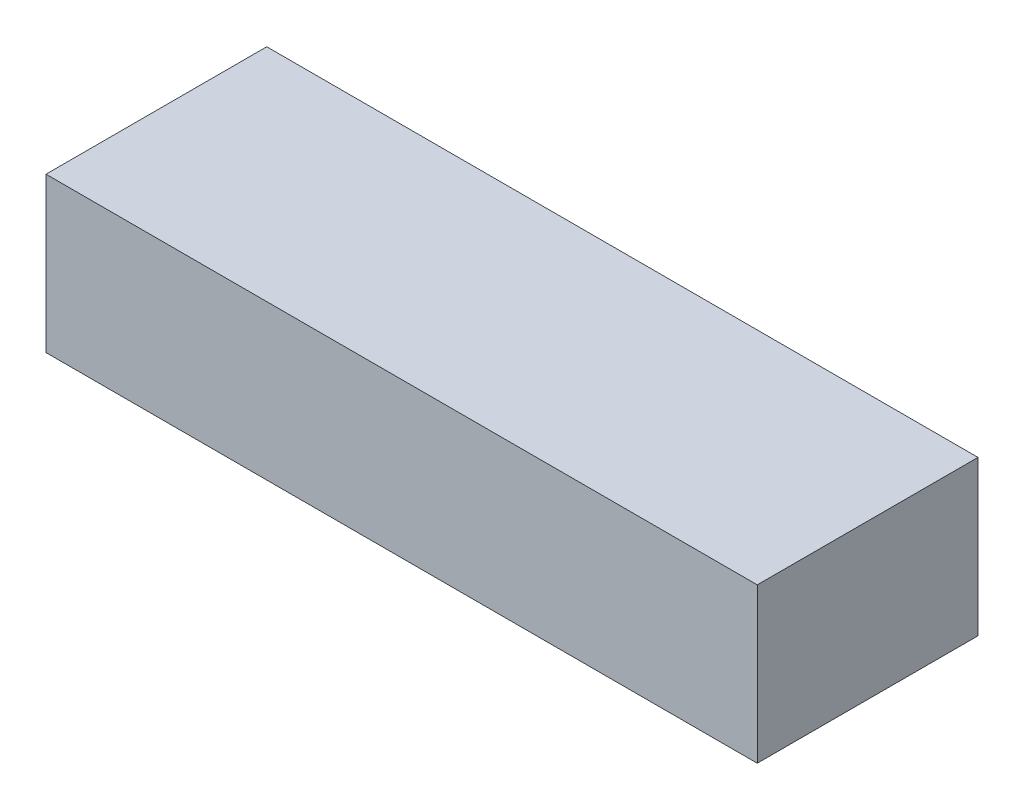
ISO-10303-21;
HEADER;
FILE_DESCRIPTION(('STEP AP214'),'2;1');
FILE_NAME('part.step','',(''),(''),'','','');
FILE_SCHEMA(('AUTOMOTIVE_DESIGN { 1 0 10303 214 1 1 1 1 }'));
ENDSEC;
DATA;
#1=APPLICATION_CONTEXT('core data for automotive mechanical design processes');
#2=APPLICATION_PROTOCOL_DEFINITION('international standard','automotive_design',2000,#1);
#3=PRODUCT_CONTEXT('',#1,'mechanical');
#4=PRODUCT('Part','Part','',(#3));
#5=PRODUCT_RELATED_PRODUCT_CATEGORY('part','',(#4));
#6=PRODUCT_DEFINITION_FORMATION('','',#4);
#7=PRODUCT_DEFINITION_CONTEXT('part definition',#1,'design');
#8=PRODUCT_DEFINITION('design','',#6,#7);
#9=PRODUCT_DEFINITION_SHAPE('','',#8);
#10=(LENGTH_UNIT() NAMED_UNIT(*) SI_UNIT(.MILLI.,.METRE.));
#11=(NAMED_UNIT(*) PLANE_ANGLE_UNIT() SI_UNIT($,.RADIAN.));
#12=(NAMED_UNIT(*) SI_UNIT($,.STERADIAN.) SOLID_ANGLE_UNIT());
#13=UNCERTAINTY_MEASURE_WITH_UNIT(LENGTH_MEASURE(1.E-05),#10,'distance_accuracy_value','');
#14=(GEOMETRIC_REPRESENTATION_CONTEXT(3) GLOBAL_UNCERTAINTY_ASSIGNED_CONTEXT((#13)) GLOBAL_UNIT_ASSIGNED_CONTEXT((#10,
#11,#12)) REPRESENTATION_CONTEXT('',''));
#15=CARTESIAN_POINT('',(0.,0.,0.));
#16=DIRECTION('',(0.,0.,1.));
#17=DIRECTION('',(1.,0.,0.));
#18=AXIS2_PLACEMENT_3D('',#15,#16,#17);
#19=CARTESIAN_POINT('',(72.5,31.5,22.5));
#20=DIRECTION('',(-1.,0.,0.));
#21=DIRECTION('',(0.,0.,1.));
#22=AXIS2_PLACEMENT_3D('',#19,#20,#21);
#23=PLANE('',#22);
#24=DIRECTION('',(0.,0.,-1.));
#25=VECTOR('',#24,1.);
#26=CARTESIAN_POINT('',(72.5,0.,22.5));
#27=LINE('',#26,#25);
#28=CARTESIAN_POINT('',(72.5,0.,22.5));
#29=VERTEX_POINT('',#28);
#30=CARTESIAN_POINT('',(72.5,0.,-22.5));
#31=VERTEX_POINT('',#30);
#32=EDGE_CURVE('E113',#29,#31,#27,.T.);
#33=ORIENTED_EDGE('',*,*,#32,.T.);
#34=DIRECTION('',(0.,-1.,0.));
#35=VECTOR('',#34,1.);
#36=CARTESIAN_POINT('',(72.5,31.5,-22.5));
#37=LINE('',#36,#35);
#38=CARTESIAN_POINT('',(72.5,31.5,-22.5));
#39=VERTEX_POINT('',#38);
#40=EDGE_CURVE('E11',#39,#31,#37,.T.);
#41=ORIENTED_EDGE('',*,*,#40,.F.);
#42=DIRECTION('',(0.,0.,-1.));
#43=VECTOR('',#42,1.);
#44=CARTESIAN_POINT('',(72.5,31.5,22.5));
#45=LINE('',#44,#43);
#46=CARTESIAN_POINT('',(72.5,31.5,22.5));
#47=VERTEX_POINT('',#46);
#48=EDGE_CURVE('E97',#47,#39,#45,.T.);
#49=ORIENTED_EDGE('',*,*,#48,.F.);
#50=DIRECTION('',(0.,-1.,0.));
#51=VECTOR('',#50,1.);
#52=CARTESIAN_POINT('',(72.5,31.5,22.5));
#53=LINE('',#52,#51);
#54=EDGE_CURVE('E109',#47,#29,#53,.T.);
#55=ORIENTED_EDGE('',*,*,#54,.T.);
#56=EDGE_LOOP('',(#33,#41,#49,#55));
#57=FACE_BOUND('',#56,.T.);
#58=ADVANCED_FACE('F45',(#57),#23,.F.);
#59=CARTESIAN_POINT('',(-72.5,31.5,-22.5));
#60=DIRECTION('',(0.,0.,1.));
#61=DIRECTION('',(1.,0.,0.));
#62=AXIS2_PLACEMENT_3D('',#59,#60,#61);
#63=PLANE('',#62);
#64=DIRECTION('',(-1.,0.,0.));
#65=VECTOR('',#64,1.);
#66=CARTESIAN_POINT('',(-72.5,0.,-22.5));
#67=LINE('',#66,#65);
#68=CARTESIAN_POINT('',(-72.5,0.,-22.5));
#69=VERTEX_POINT('',#68);
#70=EDGE_CURVE('E102',#31,#69,#67,.T.);
#71=ORIENTED_EDGE('',*,*,#70,.T.);
#72=DIRECTION('',(0.,-1.,0.));
#73=VECTOR('',#72,1.);
#74=CARTESIAN_POINT('',(-72.5,31.5,-22.5));
#75=LINE('',#74,#73);
#76=CARTESIAN_POINT('',(-72.5,31.5,-22.5));
#77=VERTEX_POINT('',#76);
#78=EDGE_CURVE('E54',#77,#69,#75,.T.);
#79=ORIENTED_EDGE('',*,*,#78,.F.);
#80=DIRECTION('',(-1.,0.,0.));
#81=VECTOR('',#80,1.);
#82=CARTESIAN_POINT('',(-72.5,31.5,-22.5));
#83=LINE('',#82,#81);
#84=EDGE_CURVE('E92',#39,#77,#83,.T.);
#85=ORIENTED_EDGE('',*,*,#84,.F.);
#86=ORIENTED_EDGE('',*,*,#40,.T.);
#87=EDGE_LOOP('',(#71,#79,#85,#86));
#88=FACE_BOUND('',#87,.T.);
#89=ADVANCED_FACE('F101',(#88),#63,.F.);
#90=CARTESIAN_POINT('',(-72.5,31.5,22.5));
#91=DIRECTION('',(1.,0.,0.));
#92=DIRECTION('',(0.,0.,-1.));
#93=AXIS2_PLACEMENT_3D('',#90,#91,#92);
#94=PLANE('',#93);
#95=DIRECTION('',(0.,0.,1.));
#96=VECTOR('',#95,1.);
#97=CARTESIAN_POINT('',(-72.5,0.,22.5));
#98=LINE('',#97,#96);
#99=CARTESIAN_POINT('',(-72.5,0.,22.5));
#100=VERTEX_POINT('',#99);
#101=EDGE_CURVE('E79',#69,#100,#98,.T.);
#102=ORIENTED_EDGE('',*,*,#101,.T.);
#103=DIRECTION('',(0.,-1.,0.));
#104=VECTOR('',#103,1.);
#105=CARTESIAN_POINT('',(-72.5,31.5,22.5));
#106=LINE('',#105,#104);
#107=CARTESIAN_POINT('',(-72.5,31.5,22.5));
#108=VERTEX_POINT('',#107);
#109=EDGE_CURVE('E104',#108,#100,#106,.T.);
#110=ORIENTED_EDGE('',*,*,#109,.F.);
#111=DIRECTION('',(0.,0.,1.));
#112=VECTOR('',#111,1.);
#113=CARTESIAN_POINT('',(-72.5,31.5,22.5));
#114=LINE('',#113,#112);
#115=EDGE_CURVE('E95',#77,#108,#114,.T.);
#116=ORIENTED_EDGE('',*,*,#115,.F.);
#117=ORIENTED_EDGE('',*,*,#78,.T.);
#118=EDGE_LOOP('',(#102,#110,#116,#117));
#119=FACE_BOUND('',#118,.T.);
#120=ADVANCED_FACE('F105',(#119),#94,.F.);
#121=CARTESIAN_POINT('',(-72.5,31.5,22.5));
#122=DIRECTION('',(0.,0.,-1.));
#123=DIRECTION('',(-1.,0.,0.));
#124=AXIS2_PLACEMENT_3D('',#121,#122,#123);
#125=PLANE('',#124);
#126=DIRECTION('',(1.,0.,0.));
#127=VECTOR('',#126,1.);
#128=CARTESIAN_POINT('',(-72.5,0.,22.5));
#129=LINE('',#128,#127);
#130=EDGE_CURVE('E85',#100,#29,#129,.T.);
#131=ORIENTED_EDGE('',*,*,#130,.T.);
#132=ORIENTED_EDGE('',*,*,#54,.F.);
#133=DIRECTION('',(1.,0.,0.));
#134=VECTOR('',#133,1.);
#135=CARTESIAN_POINT('',(-72.5,31.5,22.5));
#136=LINE('',#135,#134);
#137=EDGE_CURVE('E62',#108,#47,#136,.T.);
#138=ORIENTED_EDGE('',*,*,#137,.F.);
#139=ORIENTED_EDGE('',*,*,#109,.T.);
#140=EDGE_LOOP('',(#131,#132,#138,#139));
#141=FACE_BOUND('',#140,.T.);
#142=ADVANCED_FACE('F126',(#141),#125,.F.);
#143=CARTESIAN_POINT('',(0.,31.5,0.));
#144=DIRECTION('',(0.,-1.,0.));
#145=DIRECTION('',(0.,0.,-1.));
#146=AXIS2_PLACEMENT_3D('',#143,#144,#145);
#147=PLANE('',#146);
#148=ORIENTED_EDGE('',*,*,#48,.T.);
#149=ORIENTED_EDGE('',*,*,#84,.T.);
#150=ORIENTED_EDGE('',*,*,#115,.T.);
#151=ORIENTED_EDGE('',*,*,#137,.T.);
#152=EDGE_LOOP('',(#148,#149,#150,#151));
#153=FACE_BOUND('',#152,.T.);
#154=ADVANCED_FACE('F93',(#153),#147,.F.);
#155=CARTESIAN_POINT('',(0.,0.,0.));
#156=DIRECTION('',(0.,-1.,0.));
#157=DIRECTION('',(0.,0.,-1.));
#158=AXIS2_PLACEMENT_3D('',#155,#156,#157);
#159=PLANE('',#158);
#160=ORIENTED_EDGE('',*,*,#32,.F.);
#161=ORIENTED_EDGE('',*,*,#130,.F.);
#162=ORIENTED_EDGE('',*,*,#101,.F.);
#163=ORIENTED_EDGE('',*,*,#70,.F.);
#164=EDGE_LOOP('',(#160,#161,#162,#163));
#165=FACE_BOUND('',#164,.T.);
#166=ADVANCED_FACE('F129',(#165),#159,.T.);
#167=CLOSED_SHELL('',(#58,#89,#120,#142,#154,#166));
#168=MANIFOLD_SOLID_BREP('B2',#167);
#169=ADVANCED_BREP_SHAPE_REPRESENTATION('',(#18,#168),#14);
#170=SHAPE_DEFINITION_REPRESENTATION(#9,#169);
ENDSEC;
END-ISO-10303-21;
